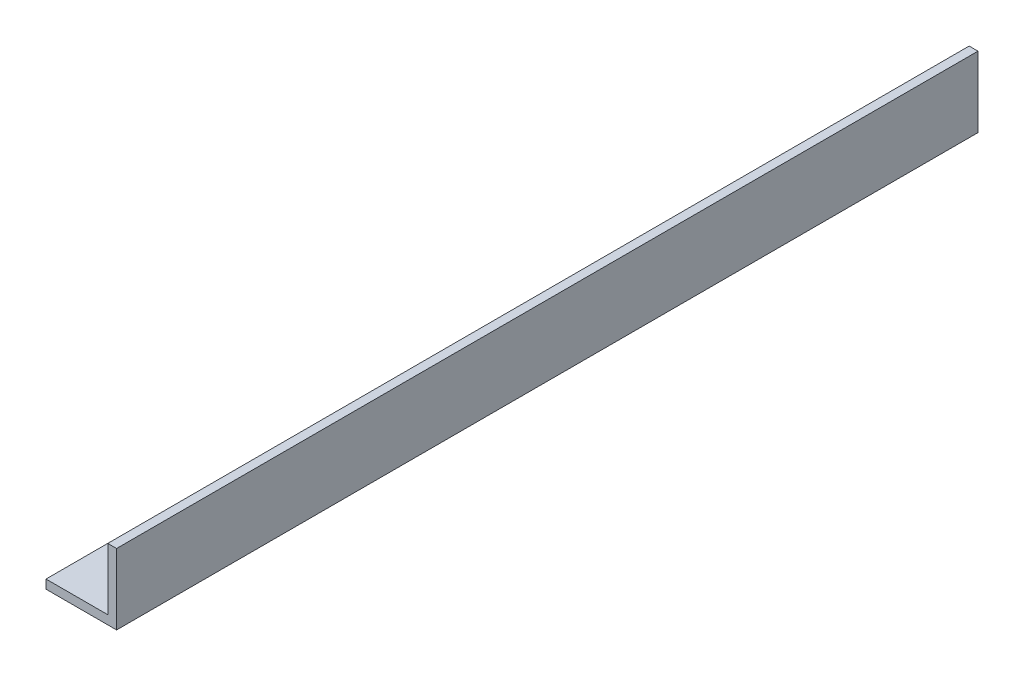
ISO-10303-21;
HEADER;
FILE_DESCRIPTION(('STEP AP214'),'2;1');
FILE_NAME('part.step','',(''),(''),'','','');
FILE_SCHEMA(('AUTOMOTIVE_DESIGN { 1 0 10303 214 1 1 1 1 }'));
ENDSEC;
DATA;
#1=APPLICATION_CONTEXT('core data for automotive mechanical design processes');
#2=APPLICATION_PROTOCOL_DEFINITION('international standard','automotive_design',2000,#1);
#3=PRODUCT_CONTEXT('',#1,'mechanical');
#4=PRODUCT('Part','Part','',(#3));
#5=PRODUCT_RELATED_PRODUCT_CATEGORY('part','',(#4));
#6=PRODUCT_DEFINITION_FORMATION('','',#4);
#7=PRODUCT_DEFINITION_CONTEXT('part definition',#1,'design');
#8=PRODUCT_DEFINITION('design','',#6,#7);
#9=PRODUCT_DEFINITION_SHAPE('','',#8);
#10=(LENGTH_UNIT() NAMED_UNIT(*) SI_UNIT(.MILLI.,.METRE.));
#11=(NAMED_UNIT(*) PLANE_ANGLE_UNIT() SI_UNIT($,.RADIAN.));
#12=(NAMED_UNIT(*) SI_UNIT($,.STERADIAN.) SOLID_ANGLE_UNIT());
#13=UNCERTAINTY_MEASURE_WITH_UNIT(LENGTH_MEASURE(1.E-05),#10,'distance_accuracy_value','');
#14=(GEOMETRIC_REPRESENTATION_CONTEXT(3) GLOBAL_UNCERTAINTY_ASSIGNED_CONTEXT((#13)) GLOBAL_UNIT_ASSIGNED_CONTEXT((#10,
#11,#12)) REPRESENTATION_CONTEXT('',''));
#15=CARTESIAN_POINT('',(0.,0.,0.));
#16=DIRECTION('',(0.,0.,1.));
#17=DIRECTION('',(1.,0.,0.));
#18=AXIS2_PLACEMENT_3D('',#15,#16,#17);
#19=CARTESIAN_POINT('',(0.,3.175,310.));
#20=DIRECTION('',(1.,0.,0.));
#21=DIRECTION('',(0.,0.,-1.));
#22=AXIS2_PLACEMENT_3D('',#19,#20,#21);
#23=PLANE('',#22);
#24=DIRECTION('',(0.,-1.,0.));
#25=VECTOR('',#24,1.);
#26=CARTESIAN_POINT('',(0.,3.175,0.));
#27=LINE('',#26,#25);
#28=CARTESIAN_POINT('',(0.,3.175,0.));
#29=VERTEX_POINT('',#28);
#30=CARTESIAN_POINT('',(0.,0.,0.));
#31=VERTEX_POINT('',#30);
#32=EDGE_CURVE('E130',#29,#31,#27,.T.);
#33=ORIENTED_EDGE('',*,*,#32,.T.);
#34=DIRECTION('',(0.,0.,-1.));
#35=VECTOR('',#34,1.);
#36=CARTESIAN_POINT('',(0.,0.,310.));
#37=LINE('',#36,#35);
#38=CARTESIAN_POINT('',(0.,0.,310.));
#39=VERTEX_POINT('',#38);
#40=EDGE_CURVE('E11',#39,#31,#37,.T.);
#41=ORIENTED_EDGE('',*,*,#40,.F.);
#42=DIRECTION('',(0.,-1.,0.));
#43=VECTOR('',#42,1.);
#44=CARTESIAN_POINT('',(0.,3.175,310.));
#45=LINE('',#44,#43);
#46=CARTESIAN_POINT('',(0.,3.175,310.));
#47=VERTEX_POINT('',#46);
#48=EDGE_CURVE('E146',#47,#39,#45,.T.);
#49=ORIENTED_EDGE('',*,*,#48,.F.);
#50=DIRECTION('',(0.,0.,-1.));
#51=VECTOR('',#50,1.);
#52=CARTESIAN_POINT('',(0.,3.175,310.));
#53=LINE('',#52,#51);
#54=EDGE_CURVE('E126',#47,#29,#53,.T.);
#55=ORIENTED_EDGE('',*,*,#54,.T.);
#56=EDGE_LOOP('',(#33,#41,#49,#55));
#57=FACE_BOUND('',#56,.T.);
#58=ADVANCED_FACE('F39',(#57),#23,.F.);
#59=CARTESIAN_POINT('',(0.,0.,310.));
#60=DIRECTION('',(0.,1.,0.));
#61=DIRECTION('',(0.,0.,1.));
#62=AXIS2_PLACEMENT_3D('',#59,#60,#61);
#63=PLANE('',#62);
#64=CARTESIAN_POINT('',(12.7,0.,290.));
#65=DIRECTION('',(0.,-1.,0.));
#66=DIRECTION('',(0.,0.,-1.));
#67=AXIS2_PLACEMENT_3D('',#64,#65,#66);
#68=CIRCLE('',#67,2.);
#69=CARTESIAN_POINT('',(12.7,0.,288.));
#70=VERTEX_POINT('',#69);
#71=EDGE_CURVE('E158',#70,#70,#68,.T.);
#72=ORIENTED_EDGE('',*,*,#71,.F.);
#73=EDGE_LOOP('',(#72));
#74=FACE_BOUND('',#73,.T.);
#75=CARTESIAN_POINT('',(12.7,0.,20.));
#76=DIRECTION('',(0.,-1.,0.));
#77=DIRECTION('',(0.,0.,1.));
#78=AXIS2_PLACEMENT_3D('',#75,#76,#77);
#79=CIRCLE('',#78,2.);
#80=CARTESIAN_POINT('',(12.7,0.,22.));
#81=VERTEX_POINT('',#80);
#82=EDGE_CURVE('E165',#81,#81,#79,.T.);
#83=ORIENTED_EDGE('',*,*,#82,.F.);
#84=EDGE_LOOP('',(#83));
#85=FACE_BOUND('',#84,.T.);
#86=DIRECTION('',(1.,0.,0.));
#87=VECTOR('',#86,1.);
#88=CARTESIAN_POINT('',(0.,0.,0.));
#89=LINE('',#88,#87);
#90=CARTESIAN_POINT('',(25.4,0.,0.));
#91=VERTEX_POINT('',#90);
#92=EDGE_CURVE('E134',#31,#91,#89,.T.);
#93=ORIENTED_EDGE('',*,*,#92,.T.);
#94=DIRECTION('',(0.,0.,-1.));
#95=VECTOR('',#94,1.);
#96=CARTESIAN_POINT('',(25.4,0.,310.));
#97=LINE('',#96,#95);
#98=CARTESIAN_POINT('',(25.4,0.,310.));
#99=VERTEX_POINT('',#98);
#100=EDGE_CURVE('E49',#99,#91,#97,.T.);
#101=ORIENTED_EDGE('',*,*,#100,.F.);
#102=DIRECTION('',(1.,0.,0.));
#103=VECTOR('',#102,1.);
#104=CARTESIAN_POINT('',(0.,0.,310.));
#105=LINE('',#104,#103);
#106=EDGE_CURVE('E95',#39,#99,#105,.T.);
#107=ORIENTED_EDGE('',*,*,#106,.F.);
#108=ORIENTED_EDGE('',*,*,#40,.T.);
#109=EDGE_LOOP('',(#93,#101,#107,#108));
#110=FACE_BOUND('',#109,.T.);
#111=ADVANCED_FACE('F179',(#74,#85,#110),#63,.F.);
#112=CARTESIAN_POINT('',(25.4,0.,310.));
#113=DIRECTION('',(-1.,0.,0.));
#114=DIRECTION('',(0.,0.,1.));
#115=AXIS2_PLACEMENT_3D('',#112,#113,#114);
#116=PLANE('',#115);
#117=DIRECTION('',(0.,1.,0.));
#118=VECTOR('',#117,1.);
#119=CARTESIAN_POINT('',(25.4,0.,0.));
#120=LINE('',#119,#118);
#121=CARTESIAN_POINT('',(25.4,25.4,0.));
#122=VERTEX_POINT('',#121);
#123=EDGE_CURVE('E137',#91,#122,#120,.T.);
#124=ORIENTED_EDGE('',*,*,#123,.T.);
#125=DIRECTION('',(0.,0.,-1.));
#126=VECTOR('',#125,1.);
#127=CARTESIAN_POINT('',(25.4,25.4,310.));
#128=LINE('',#127,#126);
#129=CARTESIAN_POINT('',(25.4,25.4,310.));
#130=VERTEX_POINT('',#129);
#131=EDGE_CURVE('E119',#130,#122,#128,.T.);
#132=ORIENTED_EDGE('',*,*,#131,.F.);
#133=DIRECTION('',(0.,1.,0.));
#134=VECTOR('',#133,1.);
#135=CARTESIAN_POINT('',(25.4,0.,310.));
#136=LINE('',#135,#134);
#137=EDGE_CURVE('E108',#99,#130,#136,.T.);
#138=ORIENTED_EDGE('',*,*,#137,.F.);
#139=ORIENTED_EDGE('',*,*,#100,.T.);
#140=EDGE_LOOP('',(#124,#132,#138,#139));
#141=FACE_BOUND('',#140,.T.);
#142=ADVANCED_FACE('F182',(#141),#116,.F.);
#143=CARTESIAN_POINT('',(25.4,25.4,310.));
#144=DIRECTION('',(0.,-1.,0.));
#145=DIRECTION('',(0.,0.,-1.));
#146=AXIS2_PLACEMENT_3D('',#143,#144,#145);
#147=PLANE('',#146);
#148=DIRECTION('',(-1.,0.,0.));
#149=VECTOR('',#148,1.);
#150=CARTESIAN_POINT('',(25.4,25.4,0.));
#151=LINE('',#150,#149);
#152=CARTESIAN_POINT('',(22.225,25.4,0.));
#153=VERTEX_POINT('',#152);
#154=EDGE_CURVE('E117',#122,#153,#151,.T.);
#155=ORIENTED_EDGE('',*,*,#154,.T.);
#156=DIRECTION('',(0.,0.,-1.));
#157=VECTOR('',#156,1.);
#158=CARTESIAN_POINT('',(22.225,25.4,310.));
#159=LINE('',#158,#157);
#160=CARTESIAN_POINT('',(22.225,25.4,310.));
#161=VERTEX_POINT('',#160);
#162=EDGE_CURVE('E114',#161,#153,#159,.T.);
#163=ORIENTED_EDGE('',*,*,#162,.F.);
#164=DIRECTION('',(-1.,0.,0.));
#165=VECTOR('',#164,1.);
#166=CARTESIAN_POINT('',(25.4,25.4,310.));
#167=LINE('',#166,#165);
#168=EDGE_CURVE('E102',#130,#161,#167,.T.);
#169=ORIENTED_EDGE('',*,*,#168,.F.);
#170=ORIENTED_EDGE('',*,*,#131,.T.);
#171=EDGE_LOOP('',(#155,#163,#169,#170));
#172=FACE_BOUND('',#171,.T.);
#173=ADVANCED_FACE('F115',(#172),#147,.F.);
#174=CARTESIAN_POINT('',(22.225,3.175,310.));
#175=DIRECTION('',(1.,0.,0.));
#176=DIRECTION('',(0.,0.,-1.));
#177=AXIS2_PLACEMENT_3D('',#174,#175,#176);
#178=PLANE('',#177);
#179=DIRECTION('',(0.,-1.,0.));
#180=VECTOR('',#179,1.);
#181=CARTESIAN_POINT('',(22.225,3.175,0.));
#182=LINE('',#181,#180);
#183=CARTESIAN_POINT('',(22.225,3.175,0.));
#184=VERTEX_POINT('',#183);
#185=EDGE_CURVE('E81',#153,#184,#182,.T.);
#186=ORIENTED_EDGE('',*,*,#185,.T.);
#187=DIRECTION('',(0.,0.,-1.));
#188=VECTOR('',#187,1.);
#189=CARTESIAN_POINT('',(22.225,3.175,310.));
#190=LINE('',#189,#188);
#191=CARTESIAN_POINT('',(22.225,3.175,310.));
#192=VERTEX_POINT('',#191);
#193=EDGE_CURVE('E120',#192,#184,#190,.T.);
#194=ORIENTED_EDGE('',*,*,#193,.F.);
#195=DIRECTION('',(0.,-1.,0.));
#196=VECTOR('',#195,1.);
#197=CARTESIAN_POINT('',(22.225,3.175,310.));
#198=LINE('',#197,#196);
#199=EDGE_CURVE('E106',#161,#192,#198,.T.);
#200=ORIENTED_EDGE('',*,*,#199,.F.);
#201=ORIENTED_EDGE('',*,*,#162,.T.);
#202=EDGE_LOOP('',(#186,#194,#200,#201));
#203=FACE_BOUND('',#202,.T.);
#204=ADVANCED_FACE('F122',(#203),#178,.F.);
#205=CARTESIAN_POINT('',(0.,3.175,310.));
#206=DIRECTION('',(0.,-1.,0.));
#207=DIRECTION('',(0.,0.,-1.));
#208=AXIS2_PLACEMENT_3D('',#205,#206,#207);
#209=PLANE('',#208);
#210=CARTESIAN_POINT('',(12.7,3.17499999999998,290.));
#211=DIRECTION('',(0.,-1.,0.));
#212=DIRECTION('',(0.,0.,-1.));
#213=AXIS2_PLACEMENT_3D('',#210,#211,#212);
#214=CIRCLE('',#213,2.);
#215=CARTESIAN_POINT('',(12.7,3.17499999999998,288.));
#216=VERTEX_POINT('',#215);
#217=EDGE_CURVE('E42',#216,#216,#214,.T.);
#218=ORIENTED_EDGE('',*,*,#217,.T.);
#219=EDGE_LOOP('',(#218));
#220=FACE_BOUND('',#219,.T.);
#221=CARTESIAN_POINT('',(12.7,3.17499999999998,20.));
#222=DIRECTION('',(0.,-1.,0.));
#223=DIRECTION('',(0.,0.,-1.));
#224=AXIS2_PLACEMENT_3D('',#221,#222,#223);
#225=CIRCLE('',#224,2.);
#226=CARTESIAN_POINT('',(12.7,3.17499999999998,18.));
#227=VERTEX_POINT('',#226);
#228=EDGE_CURVE('E155',#227,#227,#225,.T.);
#229=ORIENTED_EDGE('',*,*,#228,.T.);
#230=EDGE_LOOP('',(#229));
#231=FACE_BOUND('',#230,.T.);
#232=DIRECTION('',(-1.,0.,0.));
#233=VECTOR('',#232,1.);
#234=CARTESIAN_POINT('',(0.,3.175,0.));
#235=LINE('',#234,#233);
#236=EDGE_CURVE('E87',#184,#29,#235,.T.);
#237=ORIENTED_EDGE('',*,*,#236,.T.);
#238=ORIENTED_EDGE('',*,*,#54,.F.);
#239=DIRECTION('',(-1.,0.,0.));
#240=VECTOR('',#239,1.);
#241=CARTESIAN_POINT('',(0.,3.175,310.));
#242=LINE('',#241,#240);
#243=EDGE_CURVE('E58',#192,#47,#242,.T.);
#244=ORIENTED_EDGE('',*,*,#243,.F.);
#245=ORIENTED_EDGE('',*,*,#193,.T.);
#246=EDGE_LOOP('',(#237,#238,#244,#245));
#247=FACE_BOUND('',#246,.T.);
#248=ADVANCED_FACE('F187',(#220,#231,#247),#209,.F.);
#249=CARTESIAN_POINT('',(0.,0.,310.));
#250=DIRECTION('',(0.,0.,1.));
#251=DIRECTION('',(1.,0.,0.));
#252=AXIS2_PLACEMENT_3D('',#249,#250,#251);
#253=PLANE('',#252);
#254=ORIENTED_EDGE('',*,*,#48,.T.);
#255=ORIENTED_EDGE('',*,*,#106,.T.);
#256=ORIENTED_EDGE('',*,*,#137,.T.);
#257=ORIENTED_EDGE('',*,*,#168,.T.);
#258=ORIENTED_EDGE('',*,*,#199,.T.);
#259=ORIENTED_EDGE('',*,*,#243,.T.);
#260=EDGE_LOOP('',(#254,#255,#256,#257,#258,#259));
#261=FACE_BOUND('',#260,.T.);
#262=ADVANCED_FACE('F104',(#261),#253,.T.);
#263=CARTESIAN_POINT('',(0.,0.,0.));
#264=DIRECTION('',(0.,0.,1.));
#265=DIRECTION('',(1.,0.,0.));
#266=AXIS2_PLACEMENT_3D('',#263,#264,#265);
#267=PLANE('',#266);
#268=ORIENTED_EDGE('',*,*,#32,.F.);
#269=ORIENTED_EDGE('',*,*,#236,.F.);
#270=ORIENTED_EDGE('',*,*,#185,.F.);
#271=ORIENTED_EDGE('',*,*,#154,.F.);
#272=ORIENTED_EDGE('',*,*,#123,.F.);
#273=ORIENTED_EDGE('',*,*,#92,.F.);
#274=EDGE_LOOP('',(#268,#269,#270,#271,#272,#273));
#275=FACE_BOUND('',#274,.T.);
#276=ADVANCED_FACE('F185',(#275),#267,.F.);
#277=CARTESIAN_POINT('',(12.7,310.,20.));
#278=DIRECTION('',(0.,-1.,0.));
#279=DIRECTION('',(0.,0.,-1.));
#280=AXIS2_PLACEMENT_3D('',#277,#278,#279);
#281=CYLINDRICAL_SURFACE('',#280,2.);
#282=ORIENTED_EDGE('',*,*,#82,.T.);
#283=EDGE_LOOP('',(#282));
#284=FACE_BOUND('',#283,.T.);
#285=ORIENTED_EDGE('',*,*,#228,.F.);
#286=EDGE_LOOP('',(#285));
#287=FACE_BOUND('',#286,.T.);
#288=ADVANCED_FACE('F233',(#284,#287),#281,.F.);
#289=CARTESIAN_POINT('',(12.7,310.,290.));
#290=DIRECTION('',(0.,-1.,0.));
#291=DIRECTION('',(0.,0.,-1.));
#292=AXIS2_PLACEMENT_3D('',#289,#290,#291);
#293=CYLINDRICAL_SURFACE('',#292,2.);
#294=ORIENTED_EDGE('',*,*,#71,.T.);
#295=EDGE_LOOP('',(#294));
#296=FACE_BOUND('',#295,.T.);
#297=ORIENTED_EDGE('',*,*,#217,.F.);
#298=EDGE_LOOP('',(#297));
#299=FACE_BOUND('',#298,.T.);
#300=ADVANCED_FACE('F251',(#296,#299),#293,.F.);
#301=CLOSED_SHELL('',(#58,#111,#142,#173,#204,#248,#262,#276,#288,#300));
#302=MANIFOLD_SOLID_BREP('B2',#301);
#303=ADVANCED_BREP_SHAPE_REPRESENTATION('',(#18,#302),#14);
#304=SHAPE_DEFINITION_REPRESENTATION(#9,#303);
ENDSEC;
END-ISO-10303-21;
